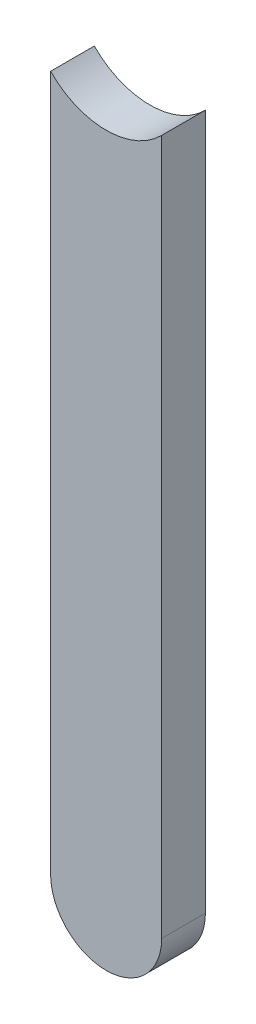
ISO-10303-21;
HEADER;
FILE_DESCRIPTION(('STEP AP214'),'2;1');
FILE_NAME('part.step','',(''),(''),'','','');
FILE_SCHEMA(('AUTOMOTIVE_DESIGN { 1 0 10303 214 1 1 1 1 }'));
ENDSEC;
DATA;
#1=APPLICATION_CONTEXT('core data for automotive mechanical design processes');
#2=APPLICATION_PROTOCOL_DEFINITION('international standard','automotive_design',2000,#1);
#3=PRODUCT_CONTEXT('',#1,'mechanical');
#4=PRODUCT('Part','Part','',(#3));
#5=PRODUCT_RELATED_PRODUCT_CATEGORY('part','',(#4));
#6=PRODUCT_DEFINITION_FORMATION('','',#4);
#7=PRODUCT_DEFINITION_CONTEXT('part definition',#1,'design');
#8=PRODUCT_DEFINITION('design','',#6,#7);
#9=PRODUCT_DEFINITION_SHAPE('','',#8);
#10=(LENGTH_UNIT() NAMED_UNIT(*) SI_UNIT(.MILLI.,.METRE.));
#11=(NAMED_UNIT(*) PLANE_ANGLE_UNIT() SI_UNIT($,.RADIAN.));
#12=(NAMED_UNIT(*) SI_UNIT($,.STERADIAN.) SOLID_ANGLE_UNIT());
#13=UNCERTAINTY_MEASURE_WITH_UNIT(LENGTH_MEASURE(1.E-05),#10,'distance_accuracy_value','');
#14=(GEOMETRIC_REPRESENTATION_CONTEXT(3) GLOBAL_UNCERTAINTY_ASSIGNED_CONTEXT((#13)) GLOBAL_UNIT_ASSIGNED_CONTEXT((#10,
#11,#12)) REPRESENTATION_CONTEXT('',''));
#15=CARTESIAN_POINT('',(0.,0.,0.));
#16=DIRECTION('',(0.,0.,1.));
#17=DIRECTION('',(1.,0.,0.));
#18=AXIS2_PLACEMENT_3D('',#15,#16,#17);
#19=CARTESIAN_POINT('',(155.067,72.39,0.));
#20=DIRECTION('',(-1.,0.,0.));
#21=DIRECTION('',(0.,1.,0.));
#22=AXIS2_PLACEMENT_3D('',#19,#20,#21);
#23=PLANE('',#22);
#24=DIRECTION('',(0.,1.,0.));
#25=VECTOR('',#24,1.);
#26=CARTESIAN_POINT('',(155.067,72.39,0.1999996));
#27=LINE('',#26,#25);
#28=CARTESIAN_POINT('',(155.067,72.39,0.1999996));
#29=VERTEX_POINT('',#28);
#30=CARTESIAN_POINT('',(155.067,75.5701318421333,0.1999996));
#31=VERTEX_POINT('',#30);
#32=EDGE_CURVE('E11',#29,#31,#27,.T.);
#33=ORIENTED_EDGE('',*,*,#32,.F.);
#34=DIRECTION('',(0.,0.,1.));
#35=VECTOR('',#34,1.);
#36=CARTESIAN_POINT('',(155.067,72.39,0.));
#37=LINE('',#36,#35);
#38=CARTESIAN_POINT('',(155.067,72.39,0.));
#39=VERTEX_POINT('',#38);
#40=EDGE_CURVE('E24',#39,#29,#37,.T.);
#41=ORIENTED_EDGE('',*,*,#40,.F.);
#42=DIRECTION('',(0.,1.,0.));
#43=VECTOR('',#42,1.);
#44=CARTESIAN_POINT('',(155.067,72.39,0.));
#45=LINE('',#44,#43);
#46=CARTESIAN_POINT('',(155.067,75.5701318421333,0.));
#47=VERTEX_POINT('',#46);
#48=EDGE_CURVE('E75',#39,#47,#45,.T.);
#49=ORIENTED_EDGE('',*,*,#48,.T.);
#50=DIRECTION('',(0.,0.,1.));
#51=VECTOR('',#50,1.);
#52=CARTESIAN_POINT('',(155.067,75.5701318421333,0.));
#53=LINE('',#52,#51);
#54=EDGE_CURVE('E37',#47,#31,#53,.T.);
#55=ORIENTED_EDGE('',*,*,#54,.T.);
#56=EDGE_LOOP('',(#33,#41,#49,#55));
#57=FACE_BOUND('',#56,.T.);
#58=ADVANCED_FACE('F17',(#57),#23,.F.);
#59=CARTESIAN_POINT('',(154.813,75.819,0.));
#60=DIRECTION('',(0.,0.,-1.));
#61=DIRECTION('',(1.,0.,0.));
#62=AXIS2_PLACEMENT_3D('',#59,#60,#61);
#63=CYLINDRICAL_SURFACE('',#62,0.3556);
#64=DIRECTION('',(0.,0.,1.));
#65=VECTOR('',#64,1.);
#66=CARTESIAN_POINT('',(154.559,75.5701318421332,0.));
#67=LINE('',#66,#65);
#68=CARTESIAN_POINT('',(154.559,75.5701318421332,0.));
#69=VERTEX_POINT('',#68);
#70=CARTESIAN_POINT('',(154.559,75.5701318421332,0.1999996));
#71=VERTEX_POINT('',#70);
#72=EDGE_CURVE('E67',#69,#71,#67,.T.);
#73=ORIENTED_EDGE('',*,*,#72,.T.);
#74=CARTESIAN_POINT('',(154.813,75.819,0.1999996));
#75=DIRECTION('',(0.,0.,1.));
#76=DIRECTION('',(1.,0.,0.));
#77=AXIS2_PLACEMENT_3D('',#74,#75,#76);
#78=CIRCLE('',#77,0.3556);
#79=EDGE_CURVE('E82',#71,#31,#78,.T.);
#80=ORIENTED_EDGE('',*,*,#79,.T.);
#81=ORIENTED_EDGE('',*,*,#54,.F.);
#82=CARTESIAN_POINT('',(154.813,75.819,0.));
#83=DIRECTION('',(0.,0.,1.));
#84=DIRECTION('',(1.,0.,0.));
#85=AXIS2_PLACEMENT_3D('',#82,#83,#84);
#86=CIRCLE('',#85,0.3556);
#87=EDGE_CURVE('E80',#69,#47,#86,.T.);
#88=ORIENTED_EDGE('',*,*,#87,.F.);
#89=EDGE_LOOP('',(#73,#80,#81,#88));
#90=FACE_BOUND('',#89,.T.);
#91=ADVANCED_FACE('F88',(#90),#63,.F.);
#92=CARTESIAN_POINT('',(154.559,75.5701318421332,0.));
#93=DIRECTION('',(1.,0.,0.));
#94=DIRECTION('',(0.,-1.,0.));
#95=AXIS2_PLACEMENT_3D('',#92,#93,#94);
#96=PLANE('',#95);
#97=DIRECTION('',(0.,-1.,0.));
#98=VECTOR('',#97,1.);
#99=CARTESIAN_POINT('',(154.559,75.819,0.1999996));
#100=LINE('',#99,#98);
#101=CARTESIAN_POINT('',(154.559,72.39,0.1999996));
#102=VERTEX_POINT('',#101);
#103=EDGE_CURVE('E71',#71,#102,#100,.T.);
#104=ORIENTED_EDGE('',*,*,#103,.F.);
#105=ORIENTED_EDGE('',*,*,#72,.F.);
#106=DIRECTION('',(0.,-1.,0.));
#107=VECTOR('',#106,1.);
#108=CARTESIAN_POINT('',(154.559,75.819,0.));
#109=LINE('',#108,#107);
#110=CARTESIAN_POINT('',(154.559,72.39,0.));
#111=VERTEX_POINT('',#110);
#112=EDGE_CURVE('E63',#69,#111,#109,.T.);
#113=ORIENTED_EDGE('',*,*,#112,.T.);
#114=DIRECTION('',(0.,0.,1.));
#115=VECTOR('',#114,1.);
#116=CARTESIAN_POINT('',(154.559,72.39,0.));
#117=LINE('',#116,#115);
#118=EDGE_CURVE('E53',#111,#102,#117,.T.);
#119=ORIENTED_EDGE('',*,*,#118,.T.);
#120=EDGE_LOOP('',(#104,#105,#113,#119));
#121=FACE_BOUND('',#120,.T.);
#122=ADVANCED_FACE('F66',(#121),#96,.F.);
#123=CARTESIAN_POINT('',(154.813,72.39,0.));
#124=DIRECTION('',(0.,0.,-1.));
#125=DIRECTION('',(-1.,0.,0.));
#126=AXIS2_PLACEMENT_3D('',#123,#124,#125);
#127=CYLINDRICAL_SURFACE('',#126,0.25400000000001);
#128=CARTESIAN_POINT('',(154.813,72.39,0.1999996));
#129=DIRECTION('',(0.,0.,1.));
#130=DIRECTION('',(-1.,0.,0.));
#131=AXIS2_PLACEMENT_3D('',#128,#129,#130);
#132=CIRCLE('',#131,0.25400000000001);
#133=EDGE_CURVE('E59',#102,#29,#132,.T.);
#134=ORIENTED_EDGE('',*,*,#133,.F.);
#135=ORIENTED_EDGE('',*,*,#118,.F.);
#136=CARTESIAN_POINT('',(154.813,72.39,0.));
#137=DIRECTION('',(0.,0.,1.));
#138=DIRECTION('',(-1.,0.,0.));
#139=AXIS2_PLACEMENT_3D('',#136,#137,#138);
#140=CIRCLE('',#139,0.25400000000001);
#141=EDGE_CURVE('E57',#111,#39,#140,.T.);
#142=ORIENTED_EDGE('',*,*,#141,.T.);
#143=ORIENTED_EDGE('',*,*,#40,.T.);
#144=EDGE_LOOP('',(#134,#135,#142,#143));
#145=FACE_BOUND('',#144,.T.);
#146=ADVANCED_FACE('F55',(#145),#127,.T.);
#147=CARTESIAN_POINT('',(155.067,72.39,0.));
#148=DIRECTION('',(0.,0.,-1.));
#149=DIRECTION('',(-1.,0.,0.));
#150=AXIS2_PLACEMENT_3D('',#147,#148,#149);
#151=PLANE('',#150);
#152=ORIENTED_EDGE('',*,*,#48,.F.);
#153=ORIENTED_EDGE('',*,*,#141,.F.);
#154=ORIENTED_EDGE('',*,*,#112,.F.);
#155=ORIENTED_EDGE('',*,*,#87,.T.);
#156=EDGE_LOOP('',(#152,#153,#154,#155));
#157=FACE_BOUND('',#156,.T.);
#158=ADVANCED_FACE('F74',(#157),#151,.T.);
#159=CARTESIAN_POINT('',(155.067,72.39,0.1999996));
#160=DIRECTION('',(0.,0.,-1.));
#161=DIRECTION('',(-1.,0.,0.));
#162=AXIS2_PLACEMENT_3D('',#159,#160,#161);
#163=PLANE('',#162);
#164=ORIENTED_EDGE('',*,*,#133,.T.);
#165=ORIENTED_EDGE('',*,*,#32,.T.);
#166=ORIENTED_EDGE('',*,*,#79,.F.);
#167=ORIENTED_EDGE('',*,*,#103,.T.);
#168=EDGE_LOOP('',(#164,#165,#166,#167));
#169=FACE_BOUND('',#168,.T.);
#170=ADVANCED_FACE('F91',(#169),#163,.F.);
#171=CLOSED_SHELL('',(#58,#91,#122,#146,#158,#170));
#172=MANIFOLD_SOLID_BREP('B1',#171);
#173=ADVANCED_BREP_SHAPE_REPRESENTATION('',(#18,#172),#14);
#174=SHAPE_DEFINITION_REPRESENTATION(#9,#173);
ENDSEC;
END-ISO-10303-21;
